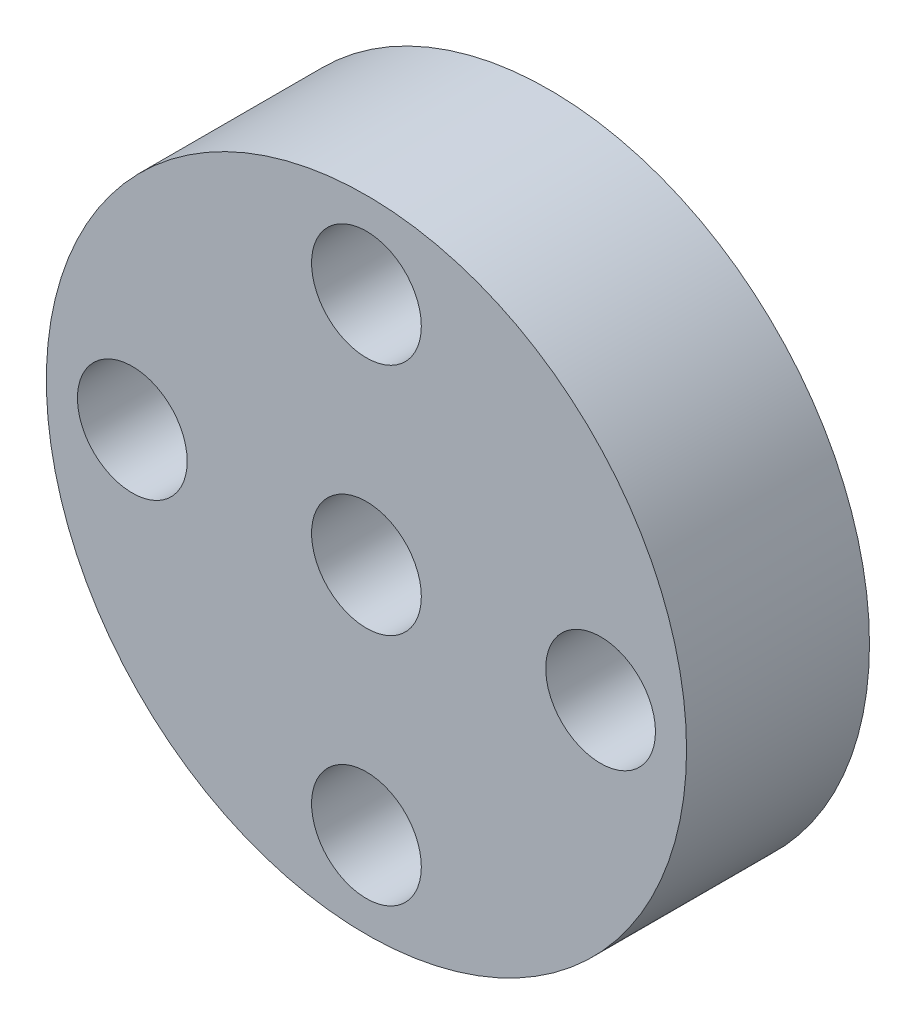
ISO-10303-21;
HEADER;
FILE_DESCRIPTION(('STEP AP214'),'2;1');
FILE_NAME('part.step','',(''),(''),'','','');
FILE_SCHEMA(('AUTOMOTIVE_DESIGN { 1 0 10303 214 1 1 1 1 }'));
ENDSEC;
DATA;
#1=APPLICATION_CONTEXT('core data for automotive mechanical design processes');
#2=APPLICATION_PROTOCOL_DEFINITION('international standard','automotive_design',2000,#1);
#3=PRODUCT_CONTEXT('',#1,'mechanical');
#4=PRODUCT('Part','Part','',(#3));
#5=PRODUCT_RELATED_PRODUCT_CATEGORY('part','',(#4));
#6=PRODUCT_DEFINITION_FORMATION('','',#4);
#7=PRODUCT_DEFINITION_CONTEXT('part definition',#1,'design');
#8=PRODUCT_DEFINITION('design','',#6,#7);
#9=PRODUCT_DEFINITION_SHAPE('','',#8);
#10=(LENGTH_UNIT() NAMED_UNIT(*) SI_UNIT(.MILLI.,.METRE.));
#11=(NAMED_UNIT(*) PLANE_ANGLE_UNIT() SI_UNIT($,.RADIAN.));
#12=(NAMED_UNIT(*) SI_UNIT($,.STERADIAN.) SOLID_ANGLE_UNIT());
#13=UNCERTAINTY_MEASURE_WITH_UNIT(LENGTH_MEASURE(1.E-05),#10,'distance_accuracy_value','');
#14=(GEOMETRIC_REPRESENTATION_CONTEXT(3) GLOBAL_UNCERTAINTY_ASSIGNED_CONTEXT((#13)) GLOBAL_UNIT_ASSIGNED_CONTEXT((#10,
#11,#12)) REPRESENTATION_CONTEXT('',''));
#15=CARTESIAN_POINT('',(0.,0.,0.));
#16=DIRECTION('',(0.,0.,1.));
#17=DIRECTION('',(1.,0.,0.));
#18=AXIS2_PLACEMENT_3D('',#15,#16,#17);
#19=CARTESIAN_POINT('',(0.,0.,2.5));
#20=DIRECTION('',(0.,0.,1.));
#21=DIRECTION('',(1.,0.,0.));
#22=AXIS2_PLACEMENT_3D('',#19,#20,#21);
#23=PLANE('',#22);
#24=CARTESIAN_POINT('',(0.,6.4,2.5));
#25=DIRECTION('',(0.,0.,1.));
#26=DIRECTION('',(1.,0.,0.));
#27=AXIS2_PLACEMENT_3D('',#24,#25,#26);
#28=CIRCLE('',#27,1.5);
#29=CARTESIAN_POINT('',(1.5,6.4,2.5));
#30=VERTEX_POINT('',#29);
#31=EDGE_CURVE('E83',#30,#30,#28,.T.);
#32=ORIENTED_EDGE('',*,*,#31,.F.);
#33=EDGE_LOOP('',(#32));
#34=FACE_BOUND('',#33,.T.);
#35=CARTESIAN_POINT('',(6.40000000000018,1.81115166403131E-13,2.5));
#36=DIRECTION('',(0.,0.,1.));
#37=DIRECTION('',(1.,0.,0.));
#38=AXIS2_PLACEMENT_3D('',#35,#36,#37);
#39=CIRCLE('',#38,1.50000000000014);
#40=CARTESIAN_POINT('',(7.90000000000032,1.81115166403131E-13,2.5));
#41=VERTEX_POINT('',#40);
#42=EDGE_CURVE('E77',#41,#41,#39,.T.);
#43=ORIENTED_EDGE('',*,*,#42,.F.);
#44=EDGE_LOOP('',(#43));
#45=FACE_BOUND('',#44,.T.);
#46=CARTESIAN_POINT('',(3.62230332806263E-13,-6.4,2.5));
#47=DIRECTION('',(0.,0.,1.));
#48=DIRECTION('',(1.,0.,0.));
#49=AXIS2_PLACEMENT_3D('',#46,#47,#48);
#50=CIRCLE('',#49,1.50000000000039);
#51=CARTESIAN_POINT('',(1.50000000000075,-6.4,2.5));
#52=VERTEX_POINT('',#51);
#53=EDGE_CURVE('E70',#52,#52,#50,.T.);
#54=ORIENTED_EDGE('',*,*,#53,.F.);
#55=EDGE_LOOP('',(#54));
#56=FACE_BOUND('',#55,.T.);
#57=CARTESIAN_POINT('',(-6.39999999999982,-1.81898940354586E-13,2.5));
#58=DIRECTION('',(0.,0.,1.));
#59=DIRECTION('',(1.,0.,0.));
#60=AXIS2_PLACEMENT_3D('',#57,#58,#59);
#61=CIRCLE('',#60,1.50000000000029);
#62=CARTESIAN_POINT('',(-4.89999999999953,-1.81898940354586E-13,2.5));
#63=VERTEX_POINT('',#62);
#64=EDGE_CURVE('E71',#63,#63,#61,.T.);
#65=ORIENTED_EDGE('',*,*,#64,.F.);
#66=EDGE_LOOP('',(#65));
#67=FACE_BOUND('',#66,.T.);
#68=CARTESIAN_POINT('',(0.,0.,2.5));
#69=DIRECTION('',(0.,0.,1.));
#70=DIRECTION('',(1.,0.,0.));
#71=AXIS2_PLACEMENT_3D('',#68,#69,#70);
#72=CIRCLE('',#71,8.75);
#73=CARTESIAN_POINT('',(8.75,0.,2.5));
#74=VERTEX_POINT('',#73);
#75=EDGE_CURVE('E12',#74,#74,#72,.T.);
#76=ORIENTED_EDGE('',*,*,#75,.T.);
#77=EDGE_LOOP('',(#76));
#78=FACE_BOUND('',#77,.T.);
#79=CARTESIAN_POINT('',(0.,0.,2.5));
#80=DIRECTION('',(0.,0.,1.));
#81=DIRECTION('',(1.,0.,0.));
#82=AXIS2_PLACEMENT_3D('',#79,#80,#81);
#83=CIRCLE('',#82,1.5);
#84=CARTESIAN_POINT('',(1.5,0.,2.5));
#85=VERTEX_POINT('',#84);
#86=EDGE_CURVE('E59',#85,#85,#83,.T.);
#87=ORIENTED_EDGE('',*,*,#86,.F.);
#88=EDGE_LOOP('',(#87));
#89=FACE_BOUND('',#88,.T.);
#90=ADVANCED_FACE('F48',(#34,#45,#56,#67,#78,#89),#23,.T.);
#91=CARTESIAN_POINT('',(0.,0.,-2.5));
#92=DIRECTION('',(0.,0.,1.));
#93=DIRECTION('',(1.,0.,0.));
#94=AXIS2_PLACEMENT_3D('',#91,#92,#93);
#95=PLANE('',#94);
#96=CARTESIAN_POINT('',(0.,6.4,-2.5));
#97=DIRECTION('',(0.,0.,1.));
#98=DIRECTION('',(1.,0.,0.));
#99=AXIS2_PLACEMENT_3D('',#96,#97,#98);
#100=CIRCLE('',#99,1.5);
#101=CARTESIAN_POINT('',(1.5,6.4,-2.5));
#102=VERTEX_POINT('',#101);
#103=EDGE_CURVE('E64',#102,#102,#100,.T.);
#104=ORIENTED_EDGE('',*,*,#103,.T.);
#105=EDGE_LOOP('',(#104));
#106=FACE_BOUND('',#105,.T.);
#107=CARTESIAN_POINT('',(6.40000000000018,1.81115166403131E-13,-2.5));
#108=DIRECTION('',(0.,0.,1.));
#109=DIRECTION('',(1.,0.,0.));
#110=AXIS2_PLACEMENT_3D('',#107,#108,#109);
#111=CIRCLE('',#110,1.50000000000014);
#112=CARTESIAN_POINT('',(7.90000000000032,1.81115166403131E-13,-2.5));
#113=VERTEX_POINT('',#112);
#114=EDGE_CURVE('E80',#113,#113,#111,.T.);
#115=ORIENTED_EDGE('',*,*,#114,.T.);
#116=EDGE_LOOP('',(#115));
#117=FACE_BOUND('',#116,.T.);
#118=CARTESIAN_POINT('',(3.62230332806263E-13,-6.4,-2.5));
#119=DIRECTION('',(0.,0.,1.));
#120=DIRECTION('',(1.,0.,0.));
#121=AXIS2_PLACEMENT_3D('',#118,#119,#120);
#122=CIRCLE('',#121,1.50000000000039);
#123=CARTESIAN_POINT('',(1.50000000000075,-6.4,-2.5));
#124=VERTEX_POINT('',#123);
#125=EDGE_CURVE('E74',#124,#124,#122,.T.);
#126=ORIENTED_EDGE('',*,*,#125,.T.);
#127=EDGE_LOOP('',(#126));
#128=FACE_BOUND('',#127,.T.);
#129=CARTESIAN_POINT('',(-6.39999999999982,-1.81898940354586E-13,-2.5));
#130=DIRECTION('',(0.,0.,1.));
#131=DIRECTION('',(1.,0.,0.));
#132=AXIS2_PLACEMENT_3D('',#129,#130,#131);
#133=CIRCLE('',#132,1.50000000000029);
#134=CARTESIAN_POINT('',(-4.89999999999953,-1.81898940354586E-13,-2.5));
#135=VERTEX_POINT('',#134);
#136=EDGE_CURVE('E67',#135,#135,#133,.T.);
#137=ORIENTED_EDGE('',*,*,#136,.T.);
#138=EDGE_LOOP('',(#137));
#139=FACE_BOUND('',#138,.T.);
#140=CARTESIAN_POINT('',(0.,0.,-2.5));
#141=DIRECTION('',(0.,0.,1.));
#142=DIRECTION('',(1.,0.,0.));
#143=AXIS2_PLACEMENT_3D('',#140,#141,#142);
#144=CIRCLE('',#143,8.75);
#145=CARTESIAN_POINT('',(8.75,0.,-2.5));
#146=VERTEX_POINT('',#145);
#147=EDGE_CURVE('E52',#146,#146,#144,.T.);
#148=ORIENTED_EDGE('',*,*,#147,.F.);
#149=EDGE_LOOP('',(#148));
#150=FACE_BOUND('',#149,.T.);
#151=CARTESIAN_POINT('',(0.,0.,-2.5));
#152=DIRECTION('',(0.,0.,1.));
#153=DIRECTION('',(1.,0.,0.));
#154=AXIS2_PLACEMENT_3D('',#151,#152,#153);
#155=CIRCLE('',#154,1.5);
#156=CARTESIAN_POINT('',(1.5,0.,-2.5));
#157=VERTEX_POINT('',#156);
#158=EDGE_CURVE('E61',#157,#157,#155,.T.);
#159=ORIENTED_EDGE('',*,*,#158,.T.);
#160=EDGE_LOOP('',(#159));
#161=FACE_BOUND('',#160,.T.);
#162=ADVANCED_FACE('F95',(#106,#117,#128,#139,#150,#161),#95,.F.);
#163=CARTESIAN_POINT('',(0.,0.,2.5));
#164=DIRECTION('',(0.,0.,-1.));
#165=DIRECTION('',(-1.,0.,0.));
#166=AXIS2_PLACEMENT_3D('',#163,#164,#165);
#167=CYLINDRICAL_SURFACE('',#166,8.75);
#168=ORIENTED_EDGE('',*,*,#75,.F.);
#169=EDGE_LOOP('',(#168));
#170=FACE_BOUND('',#169,.T.);
#171=ORIENTED_EDGE('',*,*,#147,.T.);
#172=EDGE_LOOP('',(#171));
#173=FACE_BOUND('',#172,.T.);
#174=ADVANCED_FACE('F50',(#170,#173),#167,.T.);
#175=CARTESIAN_POINT('',(0.,0.,2.5));
#176=DIRECTION('',(0.,0.,-1.));
#177=DIRECTION('',(-1.,0.,0.));
#178=AXIS2_PLACEMENT_3D('',#175,#176,#177);
#179=CYLINDRICAL_SURFACE('',#178,1.5);
#180=ORIENTED_EDGE('',*,*,#86,.T.);
#181=EDGE_LOOP('',(#180));
#182=FACE_BOUND('',#181,.T.);
#183=ORIENTED_EDGE('',*,*,#158,.F.);
#184=EDGE_LOOP('',(#183));
#185=FACE_BOUND('',#184,.T.);
#186=ADVANCED_FACE('F105',(#182,#185),#179,.F.);
#187=CARTESIAN_POINT('',(-6.39999999999982,-1.81898940354586E-13,-2.5));
#188=DIRECTION('',(0.,0.,1.));
#189=DIRECTION('',(1.,0.,0.));
#190=AXIS2_PLACEMENT_3D('',#187,#188,#189);
#191=CYLINDRICAL_SURFACE('',#190,1.50000000000029);
#192=ORIENTED_EDGE('',*,*,#136,.F.);
#193=EDGE_LOOP('',(#192));
#194=FACE_BOUND('',#193,.T.);
#195=ORIENTED_EDGE('',*,*,#64,.T.);
#196=EDGE_LOOP('',(#195));
#197=FACE_BOUND('',#196,.T.);
#198=ADVANCED_FACE('F108',(#194,#197),#191,.F.);
#199=CARTESIAN_POINT('',(3.62230332806263E-13,-6.4,-2.5));
#200=DIRECTION('',(0.,0.,1.));
#201=DIRECTION('',(1.,0.,0.));
#202=AXIS2_PLACEMENT_3D('',#199,#200,#201);
#203=CYLINDRICAL_SURFACE('',#202,1.50000000000039);
#204=ORIENTED_EDGE('',*,*,#125,.F.);
#205=EDGE_LOOP('',(#204));
#206=FACE_BOUND('',#205,.T.);
#207=ORIENTED_EDGE('',*,*,#53,.T.);
#208=EDGE_LOOP('',(#207));
#209=FACE_BOUND('',#208,.T.);
#210=ADVANCED_FACE('F122',(#206,#209),#203,.F.);
#211=CARTESIAN_POINT('',(6.40000000000018,1.81115166403131E-13,-2.5));
#212=DIRECTION('',(0.,0.,1.));
#213=DIRECTION('',(1.,0.,0.));
#214=AXIS2_PLACEMENT_3D('',#211,#212,#213);
#215=CYLINDRICAL_SURFACE('',#214,1.50000000000014);
#216=ORIENTED_EDGE('',*,*,#114,.F.);
#217=EDGE_LOOP('',(#216));
#218=FACE_BOUND('',#217,.T.);
#219=ORIENTED_EDGE('',*,*,#42,.T.);
#220=EDGE_LOOP('',(#219));
#221=FACE_BOUND('',#220,.T.);
#222=ADVANCED_FACE('F126',(#218,#221),#215,.F.);
#223=CARTESIAN_POINT('',(0.,6.4,-2.5));
#224=DIRECTION('',(0.,0.,1.));
#225=DIRECTION('',(1.,0.,0.));
#226=AXIS2_PLACEMENT_3D('',#223,#224,#225);
#227=CYLINDRICAL_SURFACE('',#226,1.5);
#228=ORIENTED_EDGE('',*,*,#103,.F.);
#229=EDGE_LOOP('',(#228));
#230=FACE_BOUND('',#229,.T.);
#231=ORIENTED_EDGE('',*,*,#31,.T.);
#232=EDGE_LOOP('',(#231));
#233=FACE_BOUND('',#232,.T.);
#234=ADVANCED_FACE('F91',(#230,#233),#227,.F.);
#235=CLOSED_SHELL('',(#90,#162,#174,#186,#198,#210,#222,#234));
#236=MANIFOLD_SOLID_BREP('B2',#235);
#237=ADVANCED_BREP_SHAPE_REPRESENTATION('',(#18,#236),#14);
#238=SHAPE_DEFINITION_REPRESENTATION(#9,#237);
ENDSEC;
END-ISO-10303-21;
